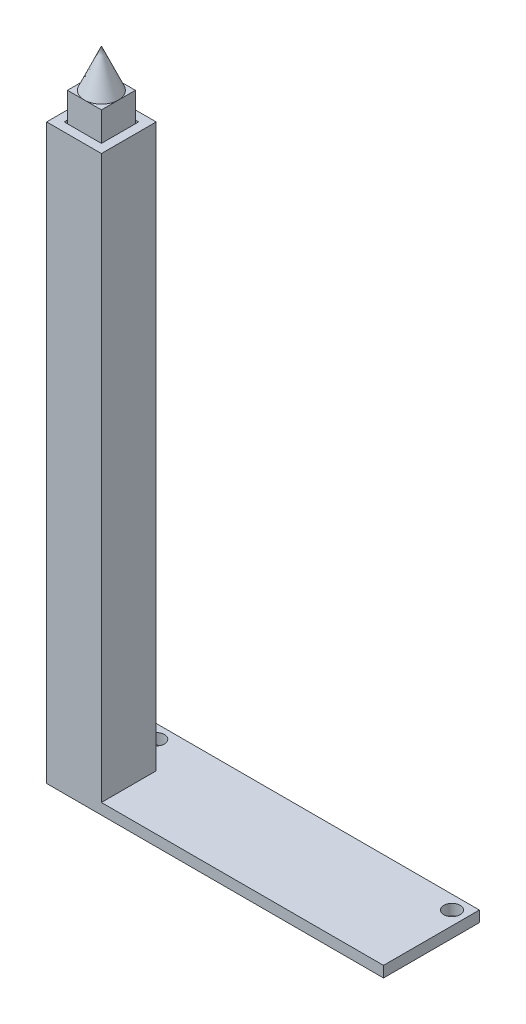
ISO-10303-21;
HEADER;
FILE_DESCRIPTION(('STEP AP214'),'2;1');
FILE_NAME('part.step','',(''),(''),'','','');
FILE_SCHEMA(('AUTOMOTIVE_DESIGN { 1 0 10303 214 1 1 1 1 }'));
ENDSEC;
DATA;
#1=APPLICATION_CONTEXT('core data for automotive mechanical design processes');
#2=APPLICATION_PROTOCOL_DEFINITION('international standard','automotive_design',2000,#1);
#3=PRODUCT_CONTEXT('',#1,'mechanical');
#4=PRODUCT('Part','Part','',(#3));
#5=PRODUCT_RELATED_PRODUCT_CATEGORY('part','',(#4));
#6=PRODUCT_DEFINITION_FORMATION('','',#4);
#7=PRODUCT_DEFINITION_CONTEXT('part definition',#1,'design');
#8=PRODUCT_DEFINITION('design','',#6,#7);
#9=PRODUCT_DEFINITION_SHAPE('','',#8);
#10=(LENGTH_UNIT() NAMED_UNIT(*) SI_UNIT(.MILLI.,.METRE.));
#11=(NAMED_UNIT(*) PLANE_ANGLE_UNIT() SI_UNIT($,.RADIAN.));
#12=(NAMED_UNIT(*) SI_UNIT($,.STERADIAN.) SOLID_ANGLE_UNIT());
#13=UNCERTAINTY_MEASURE_WITH_UNIT(LENGTH_MEASURE(1.E-05),#10,'distance_accuracy_value','');
#14=(GEOMETRIC_REPRESENTATION_CONTEXT(3) GLOBAL_UNCERTAINTY_ASSIGNED_CONTEXT((#13)) GLOBAL_UNIT_ASSIGNED_CONTEXT((#10,
#11,#12)) REPRESENTATION_CONTEXT('',''));
#15=CARTESIAN_POINT('',(0.,0.,0.));
#16=DIRECTION('',(0.,0.,1.));
#17=DIRECTION('',(1.,0.,0.));
#18=AXIS2_PLACEMENT_3D('',#15,#16,#17);
#19=CARTESIAN_POINT('',(0.,109.6,0.));
#20=DIRECTION('',(0.,1.,0.));
#21=DIRECTION('',(0.,0.,1.));
#22=AXIS2_PLACEMENT_3D('',#19,#20,#21);
#23=PLANE('',#22);
#24=DIRECTION('',(1.,0.,0.));
#25=VECTOR('',#24,1.);
#26=CARTESIAN_POINT('',(-28.85,109.6,6.85));
#27=LINE('',#26,#25);
#28=CARTESIAN_POINT('',(-28.85,109.6,6.85));
#29=VERTEX_POINT('',#28);
#30=CARTESIAN_POINT('',(-25.75,109.6,6.85));
#31=VERTEX_POINT('',#30);
#32=EDGE_CURVE('E241',#29,#31,#27,.T.);
#33=ORIENTED_EDGE('',*,*,#32,.T.);
#34=CARTESIAN_POINT('',(-25.75,109.6,3.75));
#35=DIRECTION('',(0.,1.,0.));
#36=DIRECTION('',(0.,0.,1.));
#37=AXIS2_PLACEMENT_3D('',#34,#35,#36);
#38=CIRCLE('',#37,3.10000000000001);
#39=CARTESIAN_POINT('',(-28.85,109.6,3.75));
#40=VERTEX_POINT('',#39);
#41=EDGE_CURVE('E13',#31,#40,#38,.F.);
#42=ORIENTED_EDGE('',*,*,#41,.T.);
#43=DIRECTION('',(0.,0.,1.));
#44=VECTOR('',#43,1.);
#45=CARTESIAN_POINT('',(-28.85,109.6,0.650000000000008));
#46=LINE('',#45,#44);
#47=EDGE_CURVE('E256',#40,#29,#46,.T.);
#48=ORIENTED_EDGE('',*,*,#47,.T.);
#49=EDGE_LOOP('',(#33,#42,#48));
#50=FACE_BOUND('',#49,.T.);
#51=ADVANCED_FACE('F134',(#50),#23,.T.);
#52=CARTESIAN_POINT('',(-28.85,109.6,0.650000000000008));
#53=VERTEX_POINT('',#52);
#54=EDGE_CURVE('E253',#53,#40,#46,.T.);
#55=ORIENTED_EDGE('',*,*,#54,.T.);
#56=CARTESIAN_POINT('',(-25.75,109.6,0.649999999999999));
#57=VERTEX_POINT('',#56);
#58=EDGE_CURVE('E142',#40,#57,#38,.F.);
#59=ORIENTED_EDGE('',*,*,#58,.T.);
#60=DIRECTION('',(-1.,0.,0.));
#61=VECTOR('',#60,1.);
#62=CARTESIAN_POINT('',(-22.65,109.6,0.650000000000006));
#63=LINE('',#62,#61);
#64=EDGE_CURVE('E258',#57,#53,#63,.T.);
#65=ORIENTED_EDGE('',*,*,#64,.T.);
#66=EDGE_LOOP('',(#55,#59,#65));
#67=FACE_BOUND('',#66,.T.);
#68=ADVANCED_FACE('F321',(#67),#23,.T.);
#69=CARTESIAN_POINT('',(-22.65,109.6,0.650000000000006));
#70=VERTEX_POINT('',#69);
#71=EDGE_CURVE('E230',#70,#57,#63,.T.);
#72=ORIENTED_EDGE('',*,*,#71,.T.);
#73=CARTESIAN_POINT('',(-22.65,109.6,3.75));
#74=VERTEX_POINT('',#73);
#75=EDGE_CURVE('E143',#57,#74,#38,.F.);
#76=ORIENTED_EDGE('',*,*,#75,.T.);
#77=DIRECTION('',(0.,0.,-1.));
#78=VECTOR('',#77,1.);
#79=CARTESIAN_POINT('',(-22.65,109.6,6.85));
#80=LINE('',#79,#78);
#81=EDGE_CURVE('E227',#74,#70,#80,.T.);
#82=ORIENTED_EDGE('',*,*,#81,.T.);
#83=EDGE_LOOP('',(#72,#76,#82));
#84=FACE_BOUND('',#83,.T.);
#85=ADVANCED_FACE('F226',(#84),#23,.T.);
#86=CARTESIAN_POINT('',(0.,3.,0.));
#87=DIRECTION('',(0.,-1.,0.));
#88=DIRECTION('',(0.,0.,-1.));
#89=AXIS2_PLACEMENT_3D('',#86,#87,#88);
#90=PLANE('',#89);
#91=DIRECTION('',(0.,0.,-1.));
#92=VECTOR('',#91,1.);
#93=CARTESIAN_POINT('',(-29.45,3.,7.45));
#94=LINE('',#93,#92);
#95=CARTESIAN_POINT('',(-29.45,3.,7.45));
#96=VERTEX_POINT('',#95);
#97=CARTESIAN_POINT('',(-29.45,3.,0.0500000000000083));
#98=VERTEX_POINT('',#97);
#99=EDGE_CURVE('E269',#96,#98,#94,.T.);
#100=ORIENTED_EDGE('',*,*,#99,.F.);
#101=DIRECTION('',(-1.,0.,0.));
#102=VECTOR('',#101,1.);
#103=CARTESIAN_POINT('',(-22.05,3.,7.45));
#104=LINE('',#103,#102);
#105=CARTESIAN_POINT('',(-22.05,3.,7.45));
#106=VERTEX_POINT('',#105);
#107=EDGE_CURVE('E279',#106,#96,#104,.T.);
#108=ORIENTED_EDGE('',*,*,#107,.F.);
#109=DIRECTION('',(0.,0.,1.));
#110=VECTOR('',#109,1.);
#111=CARTESIAN_POINT('',(-22.05,3.,0.0500000000000061));
#112=LINE('',#111,#110);
#113=CARTESIAN_POINT('',(-22.05,3.,0.0500000000000061));
#114=VERTEX_POINT('',#113);
#115=EDGE_CURVE('E276',#114,#106,#112,.T.);
#116=ORIENTED_EDGE('',*,*,#115,.F.);
#117=DIRECTION('',(1.,0.,0.));
#118=VECTOR('',#117,1.);
#119=CARTESIAN_POINT('',(-29.45,3.,0.0500000000000083));
#120=LINE('',#119,#118);
#121=EDGE_CURVE('E272',#98,#114,#120,.T.);
#122=ORIENTED_EDGE('',*,*,#121,.F.);
#123=EDGE_LOOP('',(#100,#108,#116,#122));
#124=FACE_BOUND('',#123,.T.);
#125=DIRECTION('',(0.,0.,1.));
#126=VECTOR('',#125,1.);
#127=CARTESIAN_POINT('',(-28.85,3.,0.650000000000008));
#128=LINE('',#127,#126);
#129=CARTESIAN_POINT('',(-28.85,3.,0.650000000000008));
#130=VERTEX_POINT('',#129);
#131=CARTESIAN_POINT('',(-28.85,3.,6.85));
#132=VERTEX_POINT('',#131);
#133=EDGE_CURVE('E156',#130,#132,#128,.T.);
#134=ORIENTED_EDGE('',*,*,#133,.F.);
#135=DIRECTION('',(-1.,0.,0.));
#136=VECTOR('',#135,1.);
#137=CARTESIAN_POINT('',(-22.65,3.,0.650000000000006));
#138=LINE('',#137,#136);
#139=CARTESIAN_POINT('',(-22.65,3.,0.650000000000006));
#140=VERTEX_POINT('',#139);
#141=EDGE_CURVE('E267',#140,#130,#138,.T.);
#142=ORIENTED_EDGE('',*,*,#141,.F.);
#143=DIRECTION('',(0.,0.,-1.));
#144=VECTOR('',#143,1.);
#145=CARTESIAN_POINT('',(-22.65,3.,6.85));
#146=LINE('',#145,#144);
#147=CARTESIAN_POINT('',(-22.65,3.,6.85));
#148=VERTEX_POINT('',#147);
#149=EDGE_CURVE('E265',#148,#140,#146,.T.);
#150=ORIENTED_EDGE('',*,*,#149,.F.);
#151=DIRECTION('',(1.,0.,0.));
#152=VECTOR('',#151,1.);
#153=CARTESIAN_POINT('',(-28.85,3.,6.85));
#154=LINE('',#153,#152);
#155=EDGE_CURVE('E262',#132,#148,#154,.T.);
#156=ORIENTED_EDGE('',*,*,#155,.F.);
#157=EDGE_LOOP('',(#134,#142,#150,#156));
#158=FACE_BOUND('',#157,.T.);
#159=ADVANCED_FACE('F309',(#124,#158),#90,.F.);
#160=CARTESIAN_POINT('',(-29.45,3.,7.45));
#161=DIRECTION('',(-1.,0.,0.));
#162=DIRECTION('',(0.,0.,1.));
#163=AXIS2_PLACEMENT_3D('',#160,#161,#162);
#164=PLANE('',#163);
#165=DIRECTION('',(0.,0.,-1.));
#166=VECTOR('',#165,1.);
#167=CARTESIAN_POINT('',(-29.45,0.,7.45));
#168=LINE('',#167,#166);
#169=CARTESIAN_POINT('',(-29.45,0.,7.45));
#170=VERTEX_POINT('',#169);
#171=CARTESIAN_POINT('',(-29.45,0.,0.0500000000000083));
#172=VERTEX_POINT('',#171);
#173=EDGE_CURVE('E244',#170,#172,#168,.T.);
#174=ORIENTED_EDGE('',*,*,#173,.F.);
#175=DIRECTION('',(0.,-1.,0.));
#176=VECTOR('',#175,1.);
#177=CARTESIAN_POINT('',(-29.45,3.,7.45));
#178=LINE('',#177,#176);
#179=EDGE_CURVE('E231',#96,#170,#178,.T.);
#180=ORIENTED_EDGE('',*,*,#179,.F.);
#181=ORIENTED_EDGE('',*,*,#99,.T.);
#182=DIRECTION('',(0.,-1.,0.));
#183=VECTOR('',#182,1.);
#184=CARTESIAN_POINT('',(-29.45,3.,0.0500000000000083));
#185=LINE('',#184,#183);
#186=EDGE_CURVE('E281',#98,#172,#185,.T.);
#187=ORIENTED_EDGE('',*,*,#186,.T.);
#188=EDGE_LOOP('',(#174,#180,#181,#187));
#189=FACE_BOUND('',#188,.T.);
#190=ADVANCED_FACE('F136',(#189),#164,.T.);
#191=CARTESIAN_POINT('',(-22.05,3.,7.45));
#192=DIRECTION('',(0.,0.,1.));
#193=DIRECTION('',(1.,0.,0.));
#194=AXIS2_PLACEMENT_3D('',#191,#192,#193);
#195=PLANE('',#194);
#196=DIRECTION('',(-1.,0.,0.));
#197=VECTOR('',#196,1.);
#198=CARTESIAN_POINT('',(-22.05,0.,7.45));
#199=LINE('',#198,#197);
#200=CARTESIAN_POINT('',(-22.05,0.,7.45));
#201=VERTEX_POINT('',#200);
#202=EDGE_CURVE('E273',#201,#170,#199,.T.);
#203=ORIENTED_EDGE('',*,*,#202,.F.);
#204=DIRECTION('',(0.,-1.,0.));
#205=VECTOR('',#204,1.);
#206=CARTESIAN_POINT('',(-22.05,3.,7.45));
#207=LINE('',#206,#205);
#208=EDGE_CURVE('E291',#106,#201,#207,.T.);
#209=ORIENTED_EDGE('',*,*,#208,.F.);
#210=ORIENTED_EDGE('',*,*,#107,.T.);
#211=ORIENTED_EDGE('',*,*,#179,.T.);
#212=EDGE_LOOP('',(#203,#209,#210,#211));
#213=FACE_BOUND('',#212,.T.);
#214=ADVANCED_FACE('F306',(#213),#195,.T.);
#215=CARTESIAN_POINT('',(-22.05,3.,0.0500000000000061));
#216=DIRECTION('',(1.,0.,0.));
#217=DIRECTION('',(0.,0.,-1.));
#218=AXIS2_PLACEMENT_3D('',#215,#216,#217);
#219=PLANE('',#218);
#220=DIRECTION('',(0.,0.,1.));
#221=VECTOR('',#220,1.);
#222=CARTESIAN_POINT('',(-22.05,0.,0.0500000000000061));
#223=LINE('',#222,#221);
#224=CARTESIAN_POINT('',(-22.05,0.,0.0500000000000061));
#225=VERTEX_POINT('',#224);
#226=EDGE_CURVE('E285',#225,#201,#223,.T.);
#227=ORIENTED_EDGE('',*,*,#226,.F.);
#228=DIRECTION('',(0.,-1.,0.));
#229=VECTOR('',#228,1.);
#230=CARTESIAN_POINT('',(-22.05,3.,0.0500000000000061));
#231=LINE('',#230,#229);
#232=EDGE_CURVE('E293',#114,#225,#231,.T.);
#233=ORIENTED_EDGE('',*,*,#232,.F.);
#234=ORIENTED_EDGE('',*,*,#115,.T.);
#235=ORIENTED_EDGE('',*,*,#208,.T.);
#236=EDGE_LOOP('',(#227,#233,#234,#235));
#237=FACE_BOUND('',#236,.T.);
#238=ADVANCED_FACE('F312',(#237),#219,.T.);
#239=CARTESIAN_POINT('',(-29.45,3.,0.0500000000000083));
#240=DIRECTION('',(0.,0.,-1.));
#241=DIRECTION('',(-1.,0.,0.));
#242=AXIS2_PLACEMENT_3D('',#239,#240,#241);
#243=PLANE('',#242);
#244=DIRECTION('',(1.,0.,0.));
#245=VECTOR('',#244,1.);
#246=CARTESIAN_POINT('',(-29.45,0.,0.0500000000000083));
#247=LINE('',#246,#245);
#248=EDGE_CURVE('E246',#172,#225,#247,.T.);
#249=ORIENTED_EDGE('',*,*,#248,.F.);
#250=ORIENTED_EDGE('',*,*,#186,.F.);
#251=ORIENTED_EDGE('',*,*,#121,.T.);
#252=ORIENTED_EDGE('',*,*,#232,.T.);
#253=EDGE_LOOP('',(#249,#250,#251,#252));
#254=FACE_BOUND('',#253,.T.);
#255=ADVANCED_FACE('F300',(#254),#243,.T.);
#256=CARTESIAN_POINT('',(0.,0.,0.));
#257=DIRECTION('',(0.,-1.,0.));
#258=DIRECTION('',(0.,0.,-1.));
#259=AXIS2_PLACEMENT_3D('',#256,#257,#258);
#260=PLANE('',#259);
#261=ORIENTED_EDGE('',*,*,#173,.T.);
#262=ORIENTED_EDGE('',*,*,#248,.T.);
#263=ORIENTED_EDGE('',*,*,#226,.T.);
#264=ORIENTED_EDGE('',*,*,#202,.T.);
#265=EDGE_LOOP('',(#261,#262,#263,#264));
#266=FACE_BOUND('',#265,.T.);
#267=ADVANCED_FACE('F303',(#266),#260,.T.);
#268=CARTESIAN_POINT('',(-28.85,123.368124086713,0.650000000000008));
#269=DIRECTION('',(1.,0.,0.));
#270=DIRECTION('',(0.,0.,-1.));
#271=AXIS2_PLACEMENT_3D('',#268,#269,#270);
#272=PLANE('',#271);
#273=ORIENTED_EDGE('',*,*,#54,.F.);
#274=DIRECTION('',(0.,-1.,0.));
#275=VECTOR('',#274,1.);
#276=CARTESIAN_POINT('',(-28.85,123.368124086713,0.650000000000008));
#277=LINE('',#276,#275);
#278=EDGE_CURVE('E221',#53,#130,#277,.T.);
#279=ORIENTED_EDGE('',*,*,#278,.T.);
#280=ORIENTED_EDGE('',*,*,#133,.T.);
#281=DIRECTION('',(0.,-1.,0.));
#282=VECTOR('',#281,1.);
#283=CARTESIAN_POINT('',(-28.85,123.368124086713,6.85));
#284=LINE('',#283,#282);
#285=EDGE_CURVE('E259',#29,#132,#284,.T.);
#286=ORIENTED_EDGE('',*,*,#285,.F.);
#287=ORIENTED_EDGE('',*,*,#47,.F.);
#288=EDGE_LOOP('',(#273,#279,#280,#286,#287));
#289=FACE_BOUND('',#288,.T.);
#290=ADVANCED_FACE('F347',(#289),#272,.F.);
#291=CARTESIAN_POINT('',(-28.85,123.368124086713,6.85));
#292=DIRECTION('',(0.,0.,-1.));
#293=DIRECTION('',(-1.,0.,0.));
#294=AXIS2_PLACEMENT_3D('',#291,#292,#293);
#295=PLANE('',#294);
#296=ORIENTED_EDGE('',*,*,#32,.F.);
#297=ORIENTED_EDGE('',*,*,#285,.T.);
#298=ORIENTED_EDGE('',*,*,#155,.T.);
#299=DIRECTION('',(0.,-1.,0.));
#300=VECTOR('',#299,1.);
#301=CARTESIAN_POINT('',(-22.65,123.368124086713,6.85));
#302=LINE('',#301,#300);
#303=CARTESIAN_POINT('',(-22.65,109.6,6.85));
#304=VERTEX_POINT('',#303);
#305=EDGE_CURVE('E263',#304,#148,#302,.T.);
#306=ORIENTED_EDGE('',*,*,#305,.F.);
#307=EDGE_CURVE('E243',#31,#304,#27,.T.);
#308=ORIENTED_EDGE('',*,*,#307,.F.);
#309=EDGE_LOOP('',(#296,#297,#298,#306,#308));
#310=FACE_BOUND('',#309,.T.);
#311=ADVANCED_FACE('F350',(#310),#295,.F.);
#312=CARTESIAN_POINT('',(-22.65,123.368124086713,6.85));
#313=DIRECTION('',(-1.,0.,0.));
#314=DIRECTION('',(0.,0.,1.));
#315=AXIS2_PLACEMENT_3D('',#312,#313,#314);
#316=PLANE('',#315);
#317=EDGE_CURVE('E236',#304,#74,#80,.T.);
#318=ORIENTED_EDGE('',*,*,#317,.F.);
#319=ORIENTED_EDGE('',*,*,#305,.T.);
#320=ORIENTED_EDGE('',*,*,#149,.T.);
#321=DIRECTION('',(0.,-1.,0.));
#322=VECTOR('',#321,1.);
#323=CARTESIAN_POINT('',(-22.65,123.368124086713,0.650000000000006));
#324=LINE('',#323,#322);
#325=EDGE_CURVE('E240',#70,#140,#324,.T.);
#326=ORIENTED_EDGE('',*,*,#325,.F.);
#327=ORIENTED_EDGE('',*,*,#81,.F.);
#328=EDGE_LOOP('',(#318,#319,#320,#326,#327));
#329=FACE_BOUND('',#328,.T.);
#330=ADVANCED_FACE('F234',(#329),#316,.F.);
#331=CARTESIAN_POINT('',(-22.65,123.368124086713,0.650000000000006));
#332=DIRECTION('',(0.,0.,1.));
#333=DIRECTION('',(1.,0.,0.));
#334=AXIS2_PLACEMENT_3D('',#331,#332,#333);
#335=PLANE('',#334);
#336=ORIENTED_EDGE('',*,*,#71,.F.);
#337=ORIENTED_EDGE('',*,*,#325,.T.);
#338=ORIENTED_EDGE('',*,*,#141,.T.);
#339=ORIENTED_EDGE('',*,*,#278,.F.);
#340=ORIENTED_EDGE('',*,*,#64,.F.);
#341=EDGE_LOOP('',(#336,#337,#338,#339,#340));
#342=FACE_BOUND('',#341,.T.);
#343=ADVANCED_FACE('F332',(#342),#335,.F.);
#344=ORIENTED_EDGE('',*,*,#317,.T.);
#345=CARTESIAN_POINT('',(-25.75,109.6,3.75));
#346=DIRECTION('',(0.,1.,0.));
#347=DIRECTION('',(0.,0.,1.));
#348=AXIS2_PLACEMENT_3D('',#345,#346,#347);
#349=CIRCLE('',#348,3.10000000000001);
#350=EDGE_CURVE('E215',#31,#74,#349,.T.);
#351=ORIENTED_EDGE('',*,*,#350,.F.);
#352=ORIENTED_EDGE('',*,*,#307,.T.);
#353=EDGE_LOOP('',(#344,#351,#352));
#354=FACE_BOUND('',#353,.T.);
#355=ADVANCED_FACE('F213',(#354),#23,.T.);
#356=CARTESIAN_POINT('',(-25.75,109.6,3.75));
#357=DIRECTION('',(0.,-1.,0.));
#358=DIRECTION('',(0.,0.,-1.));
#359=AXIS2_PLACEMENT_3D('',#356,#357,#358);
#360=CONICAL_SURFACE('',#359,3.10000000000001,0.416898070409894);
#361=CARTESIAN_POINT('',(-25.75,116.6,3.75));
#362=VERTEX_POINT('',#361);
#363=VERTEX_LOOP('',#362);
#364=FACE_BOUND('',#363,.T.);
#365=ORIENTED_EDGE('',*,*,#350,.T.);
#366=ORIENTED_EDGE('',*,*,#75,.F.);
#367=ORIENTED_EDGE('',*,*,#58,.F.);
#368=ORIENTED_EDGE('',*,*,#41,.F.);
#369=EDGE_LOOP('',(#365,#366,#367,#368));
#370=FACE_BOUND('',#369,.T.);
#371=ADVANCED_FACE('F211',(#364,#370),#360,.T.);
#372=CLOSED_SHELL('',(#51,#68,#85,#159,#190,#214,#238,#255,#267,#290,#311,#330,#343,#355,#371));
#373=MANIFOLD_SOLID_BREP('B2',#372);
#374=CARTESIAN_POINT('',(0.,2.,0.));
#375=DIRECTION('',(0.,1.,0.));
#376=DIRECTION('',(0.,0.,1.));
#377=AXIS2_PLACEMENT_3D('',#374,#375,#376);
#378=PLANE('',#377);
#379=CARTESIAN_POINT('',(-25.75,2.,-6.25));
#380=DIRECTION('',(0.,1.,0.));
#381=DIRECTION('',(0.,0.,1.));
#382=AXIS2_PLACEMENT_3D('',#379,#380,#381);
#383=CIRCLE('',#382,1.5);
#384=CARTESIAN_POINT('',(-25.75,2.,-4.75));
#385=VERTEX_POINT('',#384);
#386=EDGE_CURVE('E594',#385,#385,#383,.T.);
#387=ORIENTED_EDGE('',*,*,#386,.F.);
#388=EDGE_LOOP('',(#387));
#389=FACE_BOUND('',#388,.T.);
#390=CARTESIAN_POINT('',(28.25,2.,-6.25));
#391=DIRECTION('',(0.,1.,0.));
#392=DIRECTION('',(0.,0.,1.));
#393=AXIS2_PLACEMENT_3D('',#390,#391,#392);
#394=CIRCLE('',#393,1.5);
#395=CARTESIAN_POINT('',(28.25,2.,-4.75));
#396=VERTEX_POINT('',#395);
#397=EDGE_CURVE('E597',#396,#396,#394,.T.);
#398=ORIENTED_EDGE('',*,*,#397,.F.);
#399=EDGE_LOOP('',(#398));
#400=FACE_BOUND('',#399,.T.);
#401=DIRECTION('',(1.,0.,0.));
#402=VECTOR('',#401,1.);
#403=CARTESIAN_POINT('',(0.,2.,-1.25));
#404=LINE('',#403,#402);
#405=CARTESIAN_POINT('',(-30.75,2.,-1.25));
#406=VERTEX_POINT('',#405);
#407=CARTESIAN_POINT('',(-20.75,2.,-1.25));
#408=VERTEX_POINT('',#407);
#409=EDGE_CURVE('E458',#406,#408,#404,.T.);
#410=ORIENTED_EDGE('',*,*,#409,.T.);
#411=DIRECTION('',(0.,0.,1.));
#412=VECTOR('',#411,1.);
#413=CARTESIAN_POINT('',(-20.75,2.,0.));
#414=LINE('',#413,#412);
#415=CARTESIAN_POINT('',(-20.75,2.,8.75));
#416=VERTEX_POINT('',#415);
#417=EDGE_CURVE('E132',#408,#416,#414,.T.);
#418=ORIENTED_EDGE('',*,*,#417,.T.);
#419=DIRECTION('',(-1.,0.,0.));
#420=VECTOR('',#419,1.);
#421=CARTESIAN_POINT('',(0.,2.,8.75));
#422=LINE('',#421,#420);
#423=CARTESIAN_POINT('',(30.75,2.,8.75));
#424=VERTEX_POINT('',#423);
#425=EDGE_CURVE('E587',#424,#416,#422,.T.);
#426=ORIENTED_EDGE('',*,*,#425,.F.);
#427=DIRECTION('',(0.,0.,-1.));
#428=VECTOR('',#427,1.);
#429=CARTESIAN_POINT('',(30.75,2.,0.));
#430=LINE('',#429,#428);
#431=CARTESIAN_POINT('',(30.75,2.,-8.75));
#432=VERTEX_POINT('',#431);
#433=EDGE_CURVE('E590',#424,#432,#430,.T.);
#434=ORIENTED_EDGE('',*,*,#433,.T.);
#435=DIRECTION('',(-1.,0.,0.));
#436=VECTOR('',#435,1.);
#437=CARTESIAN_POINT('',(0.,2.,-8.75));
#438=LINE('',#437,#436);
#439=CARTESIAN_POINT('',(-30.75,2.,-8.75));
#440=VERTEX_POINT('',#439);
#441=EDGE_CURVE('E592',#432,#440,#438,.T.);
#442=ORIENTED_EDGE('',*,*,#441,.T.);
#443=DIRECTION('',(0.,0.,-1.));
#444=VECTOR('',#443,1.);
#445=CARTESIAN_POINT('',(-30.75,2.,0.));
#446=LINE('',#445,#444);
#447=EDGE_CURVE('E466',#406,#440,#446,.T.);
#448=ORIENTED_EDGE('',*,*,#447,.F.);
#449=EDGE_LOOP('',(#410,#418,#426,#434,#442,#448));
#450=FACE_BOUND('',#449,.T.);
#451=ADVANCED_FACE('F449',(#389,#400,#450),#378,.T.);
#452=CARTESIAN_POINT('',(0.,2.,8.75));
#453=DIRECTION('',(0.,0.,1.));
#454=DIRECTION('',(1.,0.,0.));
#455=AXIS2_PLACEMENT_3D('',#452,#453,#454);
#456=PLANE('',#455);
#457=DIRECTION('',(0.,-1.,0.));
#458=VECTOR('',#457,1.);
#459=CARTESIAN_POINT('',(-30.75,2.,8.75));
#460=LINE('',#459,#458);
#461=CARTESIAN_POINT('',(-30.75,104.6,8.75));
#462=VERTEX_POINT('',#461);
#463=CARTESIAN_POINT('',(-30.75,0.,8.75));
#464=VERTEX_POINT('',#463);
#465=EDGE_CURVE('E539',#462,#464,#460,.T.);
#466=ORIENTED_EDGE('',*,*,#465,.T.);
#467=DIRECTION('',(-1.,0.,0.));
#468=VECTOR('',#467,1.);
#469=CARTESIAN_POINT('',(0.,0.,8.75));
#470=LINE('',#469,#468);
#471=CARTESIAN_POINT('',(30.75,0.,8.75));
#472=VERTEX_POINT('',#471);
#473=EDGE_CURVE('E496',#472,#464,#470,.T.);
#474=ORIENTED_EDGE('',*,*,#473,.F.);
#475=DIRECTION('',(0.,-1.,0.));
#476=VECTOR('',#475,1.);
#477=CARTESIAN_POINT('',(30.75,2.,8.75));
#478=LINE('',#477,#476);
#479=EDGE_CURVE('E543',#424,#472,#478,.T.);
#480=ORIENTED_EDGE('',*,*,#479,.F.);
#481=ORIENTED_EDGE('',*,*,#425,.T.);
#482=DIRECTION('',(0.,-1.,0.));
#483=VECTOR('',#482,1.);
#484=CARTESIAN_POINT('',(-20.75,101.6,8.75));
#485=LINE('',#484,#483);
#486=CARTESIAN_POINT('',(-20.75,104.6,8.75));
#487=VERTEX_POINT('',#486);
#488=EDGE_CURVE('E739',#487,#416,#485,.T.);
#489=ORIENTED_EDGE('',*,*,#488,.F.);
#490=DIRECTION('',(1.,0.,0.));
#491=VECTOR('',#490,1.);
#492=CARTESIAN_POINT('',(0.,104.6,8.75));
#493=LINE('',#492,#491);
#494=EDGE_CURVE('E680',#462,#487,#493,.T.);
#495=ORIENTED_EDGE('',*,*,#494,.F.);
#496=EDGE_LOOP('',(#466,#474,#480,#481,#489,#495));
#497=FACE_BOUND('',#496,.T.);
#498=ADVANCED_FACE('F584',(#497),#456,.T.);
#499=CARTESIAN_POINT('',(30.75,2.,0.));
#500=DIRECTION('',(-1.,0.,0.));
#501=DIRECTION('',(0.,0.,1.));
#502=AXIS2_PLACEMENT_3D('',#499,#500,#501);
#503=PLANE('',#502);
#504=DIRECTION('',(0.,0.,-1.));
#505=VECTOR('',#504,1.);
#506=CARTESIAN_POINT('',(30.75,0.,0.));
#507=LINE('',#506,#505);
#508=CARTESIAN_POINT('',(30.75,0.,-8.75));
#509=VERTEX_POINT('',#508);
#510=EDGE_CURVE('E609',#472,#509,#507,.T.);
#511=ORIENTED_EDGE('',*,*,#510,.T.);
#512=DIRECTION('',(0.,-1.,0.));
#513=VECTOR('',#512,1.);
#514=CARTESIAN_POINT('',(30.75,2.,-8.75));
#515=LINE('',#514,#513);
#516=EDGE_CURVE('E546',#432,#509,#515,.T.);
#517=ORIENTED_EDGE('',*,*,#516,.F.);
#518=ORIENTED_EDGE('',*,*,#433,.F.);
#519=ORIENTED_EDGE('',*,*,#479,.T.);
#520=EDGE_LOOP('',(#511,#517,#518,#519));
#521=FACE_BOUND('',#520,.T.);
#522=ADVANCED_FACE('F591',(#521),#503,.F.);
#523=CARTESIAN_POINT('',(0.,2.,-8.75));
#524=DIRECTION('',(0.,0.,1.));
#525=DIRECTION('',(1.,0.,0.));
#526=AXIS2_PLACEMENT_3D('',#523,#524,#525);
#527=PLANE('',#526);
#528=DIRECTION('',(-1.,0.,0.));
#529=VECTOR('',#528,1.);
#530=CARTESIAN_POINT('',(0.,0.,-8.75));
#531=LINE('',#530,#529);
#532=CARTESIAN_POINT('',(-30.75,0.,-8.75));
#533=VERTEX_POINT('',#532);
#534=EDGE_CURVE('E611',#509,#533,#531,.T.);
#535=ORIENTED_EDGE('',*,*,#534,.T.);
#536=DIRECTION('',(0.,-1.,0.));
#537=VECTOR('',#536,1.);
#538=CARTESIAN_POINT('',(-30.75,2.,-8.75));
#539=LINE('',#538,#537);
#540=EDGE_CURVE('E553',#440,#533,#539,.T.);
#541=ORIENTED_EDGE('',*,*,#540,.F.);
#542=ORIENTED_EDGE('',*,*,#441,.F.);
#543=ORIENTED_EDGE('',*,*,#516,.T.);
#544=EDGE_LOOP('',(#535,#541,#542,#543));
#545=FACE_BOUND('',#544,.T.);
#546=ADVANCED_FACE('F619',(#545),#527,.F.);
#547=CARTESIAN_POINT('',(-30.75,2.,0.));
#548=DIRECTION('',(-1.,0.,0.));
#549=DIRECTION('',(0.,0.,1.));
#550=AXIS2_PLACEMENT_3D('',#547,#548,#549);
#551=PLANE('',#550);
#552=DIRECTION('',(0.,-1.,0.));
#553=VECTOR('',#552,1.);
#554=CARTESIAN_POINT('',(-30.75,101.6,-1.25));
#555=LINE('',#554,#553);
#556=CARTESIAN_POINT('',(-30.75,104.6,-1.25));
#557=VERTEX_POINT('',#556);
#558=EDGE_CURVE('E741',#557,#406,#555,.T.);
#559=ORIENTED_EDGE('',*,*,#558,.T.);
#560=ORIENTED_EDGE('',*,*,#447,.T.);
#561=ORIENTED_EDGE('',*,*,#540,.T.);
#562=DIRECTION('',(0.,0.,-1.));
#563=VECTOR('',#562,1.);
#564=CARTESIAN_POINT('',(-30.75,0.,0.));
#565=LINE('',#564,#563);
#566=EDGE_CURVE('E614',#464,#533,#565,.T.);
#567=ORIENTED_EDGE('',*,*,#566,.F.);
#568=ORIENTED_EDGE('',*,*,#465,.F.);
#569=DIRECTION('',(0.,0.,1.));
#570=VECTOR('',#569,1.);
#571=CARTESIAN_POINT('',(-30.75,104.6,0.));
#572=LINE('',#571,#570);
#573=EDGE_CURVE('E699',#557,#462,#572,.T.);
#574=ORIENTED_EDGE('',*,*,#573,.F.);
#575=EDGE_LOOP('',(#559,#560,#561,#567,#568,#574));
#576=FACE_BOUND('',#575,.T.);
#577=ADVANCED_FACE('F616',(#576),#551,.T.);
#578=CARTESIAN_POINT('',(-25.75,2.,-6.25));
#579=DIRECTION('',(0.,-1.,0.));
#580=DIRECTION('',(0.,0.,-1.));
#581=AXIS2_PLACEMENT_3D('',#578,#579,#580);
#582=CYLINDRICAL_SURFACE('',#581,1.5);
#583=ORIENTED_EDGE('',*,*,#386,.T.);
#584=EDGE_LOOP('',(#583));
#585=FACE_BOUND('',#584,.T.);
#586=CARTESIAN_POINT('',(-25.75,0.,-6.25));
#587=DIRECTION('',(0.,1.,0.));
#588=DIRECTION('',(0.,0.,1.));
#589=AXIS2_PLACEMENT_3D('',#586,#587,#588);
#590=CIRCLE('',#589,1.5);
#591=CARTESIAN_POINT('',(-25.75,0.,-4.75));
#592=VERTEX_POINT('',#591);
#593=EDGE_CURVE('E605',#592,#592,#590,.T.);
#594=ORIENTED_EDGE('',*,*,#593,.F.);
#595=EDGE_LOOP('',(#594));
#596=FACE_BOUND('',#595,.T.);
#597=ADVANCED_FACE('F630',(#585,#596),#582,.F.);
#598=CARTESIAN_POINT('',(28.25,2.,-6.25));
#599=DIRECTION('',(0.,-1.,0.));
#600=DIRECTION('',(0.,0.,-1.));
#601=AXIS2_PLACEMENT_3D('',#598,#599,#600);
#602=CYLINDRICAL_SURFACE('',#601,1.5);
#603=ORIENTED_EDGE('',*,*,#397,.T.);
#604=EDGE_LOOP('',(#603));
#605=FACE_BOUND('',#604,.T.);
#606=CARTESIAN_POINT('',(28.25,0.,-6.25));
#607=DIRECTION('',(0.,1.,0.));
#608=DIRECTION('',(0.,0.,1.));
#609=AXIS2_PLACEMENT_3D('',#606,#607,#608);
#610=CIRCLE('',#609,1.5);
#611=CARTESIAN_POINT('',(28.25,0.,-4.75));
#612=VERTEX_POINT('',#611);
#613=EDGE_CURVE('E541',#612,#612,#610,.T.);
#614=ORIENTED_EDGE('',*,*,#613,.F.);
#615=EDGE_LOOP('',(#614));
#616=FACE_BOUND('',#615,.T.);
#617=ADVANCED_FACE('F621',(#605,#616),#602,.F.);
#618=CARTESIAN_POINT('',(0.,0.,0.));
#619=DIRECTION('',(0.,1.,0.));
#620=DIRECTION('',(0.,0.,1.));
#621=AXIS2_PLACEMENT_3D('',#618,#619,#620);
#622=PLANE('',#621);
#623=ORIENTED_EDGE('',*,*,#473,.T.);
#624=ORIENTED_EDGE('',*,*,#566,.T.);
#625=ORIENTED_EDGE('',*,*,#534,.F.);
#626=ORIENTED_EDGE('',*,*,#510,.F.);
#627=EDGE_LOOP('',(#623,#624,#625,#626));
#628=FACE_BOUND('',#627,.T.);
#629=DIRECTION('',(-1.,0.,0.));
#630=VECTOR('',#629,1.);
#631=CARTESIAN_POINT('',(0.,0.,7.75));
#632=LINE('',#631,#630);
#633=CARTESIAN_POINT('',(-21.75,0.,7.75));
#634=VERTEX_POINT('',#633);
#635=CARTESIAN_POINT('',(-29.75,0.,7.75));
#636=VERTEX_POINT('',#635);
#637=EDGE_CURVE('E502',#634,#636,#632,.T.);
#638=ORIENTED_EDGE('',*,*,#637,.F.);
#639=DIRECTION('',(0.,0.,-1.));
#640=VECTOR('',#639,1.);
#641=CARTESIAN_POINT('',(-21.75,0.,0.));
#642=LINE('',#641,#640);
#643=CARTESIAN_POINT('',(-21.75,0.,-0.249999999999994));
#644=VERTEX_POINT('',#643);
#645=EDGE_CURVE('E514',#634,#644,#642,.T.);
#646=ORIENTED_EDGE('',*,*,#645,.T.);
#647=DIRECTION('',(-1.,0.,0.));
#648=VECTOR('',#647,1.);
#649=CARTESIAN_POINT('',(0.,0.,-0.250000000000001));
#650=LINE('',#649,#648);
#651=CARTESIAN_POINT('',(-29.75,0.,-0.249999999999992));
#652=VERTEX_POINT('',#651);
#653=EDGE_CURVE('E530',#644,#652,#650,.T.);
#654=ORIENTED_EDGE('',*,*,#653,.T.);
#655=DIRECTION('',(0.,0.,-1.));
#656=VECTOR('',#655,1.);
#657=CARTESIAN_POINT('',(-29.75,0.,0.));
#658=LINE('',#657,#656);
#659=EDGE_CURVE('E521',#636,#652,#658,.T.);
#660=ORIENTED_EDGE('',*,*,#659,.F.);
#661=EDGE_LOOP('',(#638,#646,#654,#660));
#662=FACE_BOUND('',#661,.T.);
#663=ORIENTED_EDGE('',*,*,#593,.T.);
#664=EDGE_LOOP('',(#663));
#665=FACE_BOUND('',#664,.T.);
#666=ORIENTED_EDGE('',*,*,#613,.T.);
#667=EDGE_LOOP('',(#666));
#668=FACE_BOUND('',#667,.T.);
#669=ADVANCED_FACE('F527',(#628,#662,#665,#668),#622,.F.);
#670=CARTESIAN_POINT('',(-29.75,2.,0.));
#671=DIRECTION('',(-1.,0.,0.));
#672=DIRECTION('',(0.,0.,1.));
#673=AXIS2_PLACEMENT_3D('',#670,#671,#672);
#674=PLANE('',#673);
#675=ORIENTED_EDGE('',*,*,#659,.T.);
#676=DIRECTION('',(0.,-1.,0.));
#677=VECTOR('',#676,1.);
#678=CARTESIAN_POINT('',(-29.75,2.,-0.249999999999992));
#679=LINE('',#678,#677);
#680=CARTESIAN_POINT('',(-29.75,101.6,-0.249999999999992));
#681=VERTEX_POINT('',#680);
#682=EDGE_CURVE('E525',#681,#652,#679,.T.);
#683=ORIENTED_EDGE('',*,*,#682,.F.);
#684=DIRECTION('',(0.,0.,-1.));
#685=VECTOR('',#684,1.);
#686=CARTESIAN_POINT('',(-29.75,101.6,0.));
#687=LINE('',#686,#685);
#688=CARTESIAN_POINT('',(-29.75,101.6,7.75));
#689=VERTEX_POINT('',#688);
#690=EDGE_CURVE('E524',#689,#681,#687,.T.);
#691=ORIENTED_EDGE('',*,*,#690,.F.);
#692=DIRECTION('',(0.,-1.,0.));
#693=VECTOR('',#692,1.);
#694=CARTESIAN_POINT('',(-29.75,2.,7.75));
#695=LINE('',#694,#693);
#696=EDGE_CURVE('E506',#689,#636,#695,.T.);
#697=ORIENTED_EDGE('',*,*,#696,.T.);
#698=EDGE_LOOP('',(#675,#683,#691,#697));
#699=FACE_BOUND('',#698,.T.);
#700=ADVANCED_FACE('F519',(#699),#674,.F.);
#701=CARTESIAN_POINT('',(0.,2.,-0.250000000000001));
#702=DIRECTION('',(0.,0.,1.));
#703=DIRECTION('',(1.,0.,0.));
#704=AXIS2_PLACEMENT_3D('',#701,#702,#703);
#705=PLANE('',#704);
#706=ORIENTED_EDGE('',*,*,#653,.F.);
#707=DIRECTION('',(0.,-1.,0.));
#708=VECTOR('',#707,1.);
#709=CARTESIAN_POINT('',(-21.75,2.,-0.249999999999994));
#710=LINE('',#709,#708);
#711=CARTESIAN_POINT('',(-21.75,101.6,-0.249999999999994));
#712=VERTEX_POINT('',#711);
#713=EDGE_CURVE('E536',#712,#644,#710,.T.);
#714=ORIENTED_EDGE('',*,*,#713,.F.);
#715=DIRECTION('',(-1.,0.,0.));
#716=VECTOR('',#715,1.);
#717=CARTESIAN_POINT('',(0.,101.6,-0.250000000000001));
#718=LINE('',#717,#716);
#719=EDGE_CURVE('E569',#712,#681,#718,.T.);
#720=ORIENTED_EDGE('',*,*,#719,.T.);
#721=ORIENTED_EDGE('',*,*,#682,.T.);
#722=EDGE_LOOP('',(#706,#714,#720,#721));
#723=FACE_BOUND('',#722,.T.);
#724=ADVANCED_FACE('F566',(#723),#705,.T.);
#725=CARTESIAN_POINT('',(-21.75,2.,0.));
#726=DIRECTION('',(-1.,0.,0.));
#727=DIRECTION('',(0.,0.,1.));
#728=AXIS2_PLACEMENT_3D('',#725,#726,#727);
#729=PLANE('',#728);
#730=ORIENTED_EDGE('',*,*,#645,.F.);
#731=DIRECTION('',(0.,-1.,0.));
#732=VECTOR('',#731,1.);
#733=CARTESIAN_POINT('',(-21.75,2.,7.75));
#734=LINE('',#733,#732);
#735=CARTESIAN_POINT('',(-21.75,101.6,7.75));
#736=VERTEX_POINT('',#735);
#737=EDGE_CURVE('E509',#736,#634,#734,.T.);
#738=ORIENTED_EDGE('',*,*,#737,.F.);
#739=DIRECTION('',(0.,0.,-1.));
#740=VECTOR('',#739,1.);
#741=CARTESIAN_POINT('',(-21.75,101.6,0.));
#742=LINE('',#741,#740);
#743=EDGE_CURVE('E563',#736,#712,#742,.T.);
#744=ORIENTED_EDGE('',*,*,#743,.T.);
#745=ORIENTED_EDGE('',*,*,#713,.T.);
#746=EDGE_LOOP('',(#730,#738,#744,#745));
#747=FACE_BOUND('',#746,.T.);
#748=ADVANCED_FACE('F557',(#747),#729,.T.);
#749=CARTESIAN_POINT('',(0.,2.,7.75));
#750=DIRECTION('',(0.,0.,1.));
#751=DIRECTION('',(1.,0.,0.));
#752=AXIS2_PLACEMENT_3D('',#749,#750,#751);
#753=PLANE('',#752);
#754=ORIENTED_EDGE('',*,*,#637,.T.);
#755=ORIENTED_EDGE('',*,*,#696,.F.);
#756=DIRECTION('',(-1.,0.,0.));
#757=VECTOR('',#756,1.);
#758=CARTESIAN_POINT('',(0.,101.6,7.75));
#759=LINE('',#758,#757);
#760=EDGE_CURVE('E735',#736,#689,#759,.T.);
#761=ORIENTED_EDGE('',*,*,#760,.F.);
#762=ORIENTED_EDGE('',*,*,#737,.T.);
#763=EDGE_LOOP('',(#754,#755,#761,#762));
#764=FACE_BOUND('',#763,.T.);
#765=ADVANCED_FACE('F451',(#764),#753,.F.);
#766=CARTESIAN_POINT('',(-20.75,101.6,0.));
#767=DIRECTION('',(-1.,0.,0.));
#768=DIRECTION('',(0.,0.,1.));
#769=AXIS2_PLACEMENT_3D('',#766,#767,#768);
#770=PLANE('',#769);
#771=ORIENTED_EDGE('',*,*,#417,.F.);
#772=DIRECTION('',(0.,-1.,0.));
#773=VECTOR('',#772,1.);
#774=CARTESIAN_POINT('',(-20.75,101.6,-1.25));
#775=LINE('',#774,#773);
#776=CARTESIAN_POINT('',(-20.75,104.6,-1.25));
#777=VERTEX_POINT('',#776);
#778=EDGE_CURVE('E515',#777,#408,#775,.T.);
#779=ORIENTED_EDGE('',*,*,#778,.F.);
#780=DIRECTION('',(0.,0.,-1.));
#781=VECTOR('',#780,1.);
#782=CARTESIAN_POINT('',(-20.75,104.6,0.));
#783=LINE('',#782,#781);
#784=EDGE_CURVE('E756',#487,#777,#783,.T.);
#785=ORIENTED_EDGE('',*,*,#784,.F.);
#786=ORIENTED_EDGE('',*,*,#488,.T.);
#787=EDGE_LOOP('',(#771,#779,#785,#786));
#788=FACE_BOUND('',#787,.T.);
#789=ADVANCED_FACE('F642',(#788),#770,.F.);
#790=CARTESIAN_POINT('',(0.,101.6,-1.25));
#791=DIRECTION('',(0.,0.,1.));
#792=DIRECTION('',(1.,0.,0.));
#793=AXIS2_PLACEMENT_3D('',#790,#791,#792);
#794=PLANE('',#793);
#795=ORIENTED_EDGE('',*,*,#409,.F.);
#796=ORIENTED_EDGE('',*,*,#558,.F.);
#797=DIRECTION('',(-1.,0.,0.));
#798=VECTOR('',#797,1.);
#799=CARTESIAN_POINT('',(0.,104.6,-1.25));
#800=LINE('',#799,#798);
#801=EDGE_CURVE('E754',#777,#557,#800,.T.);
#802=ORIENTED_EDGE('',*,*,#801,.F.);
#803=ORIENTED_EDGE('',*,*,#778,.T.);
#804=EDGE_LOOP('',(#795,#796,#802,#803));
#805=FACE_BOUND('',#804,.T.);
#806=ADVANCED_FACE('F645',(#805),#794,.F.);
#807=CARTESIAN_POINT('',(-29.15,104.6,0.));
#808=DIRECTION('',(1.,0.,0.));
#809=DIRECTION('',(0.,0.,-1.));
#810=AXIS2_PLACEMENT_3D('',#807,#808,#809);
#811=PLANE('',#810);
#812=DIRECTION('',(0.,0.,1.));
#813=VECTOR('',#812,1.);
#814=CARTESIAN_POINT('',(-29.15,101.6,0.));
#815=LINE('',#814,#813);
#816=CARTESIAN_POINT('',(-29.15,101.6,0.350000000000008));
#817=VERTEX_POINT('',#816);
#818=CARTESIAN_POINT('',(-29.15,101.6,7.15));
#819=VERTEX_POINT('',#818);
#820=EDGE_CURVE('E716',#817,#819,#815,.T.);
#821=ORIENTED_EDGE('',*,*,#820,.F.);
#822=DIRECTION('',(0.,-1.,0.));
#823=VECTOR('',#822,1.);
#824=CARTESIAN_POINT('',(-29.15,104.6,0.350000000000008));
#825=LINE('',#824,#823);
#826=CARTESIAN_POINT('',(-29.15,104.6,0.350000000000008));
#827=VERTEX_POINT('',#826);
#828=EDGE_CURVE('E705',#827,#817,#825,.T.);
#829=ORIENTED_EDGE('',*,*,#828,.F.);
#830=DIRECTION('',(0.,0.,1.));
#831=VECTOR('',#830,1.);
#832=CARTESIAN_POINT('',(-29.15,104.6,0.));
#833=LINE('',#832,#831);
#834=CARTESIAN_POINT('',(-29.15,104.6,7.15));
#835=VERTEX_POINT('',#834);
#836=EDGE_CURVE('E686',#827,#835,#833,.T.);
#837=ORIENTED_EDGE('',*,*,#836,.T.);
#838=DIRECTION('',(0.,-1.,0.));
#839=VECTOR('',#838,1.);
#840=CARTESIAN_POINT('',(-29.15,104.6,7.15));
#841=LINE('',#840,#839);
#842=EDGE_CURVE('E715',#835,#819,#841,.T.);
#843=ORIENTED_EDGE('',*,*,#842,.T.);
#844=EDGE_LOOP('',(#821,#829,#837,#843));
#845=FACE_BOUND('',#844,.T.);
#846=ADVANCED_FACE('F649',(#845),#811,.T.);
#847=CARTESIAN_POINT('',(0.,104.6,0.349999999999999));
#848=DIRECTION('',(0.,0.,1.));
#849=DIRECTION('',(1.,0.,0.));
#850=AXIS2_PLACEMENT_3D('',#847,#848,#849);
#851=PLANE('',#850);
#852=DIRECTION('',(-1.,0.,0.));
#853=VECTOR('',#852,1.);
#854=CARTESIAN_POINT('',(0.,101.6,0.349999999999999));
#855=LINE('',#854,#853);
#856=CARTESIAN_POINT('',(-22.35,101.6,0.350000000000006));
#857=VERTEX_POINT('',#856);
#858=EDGE_CURVE('E719',#857,#817,#855,.T.);
#859=ORIENTED_EDGE('',*,*,#858,.F.);
#860=DIRECTION('',(0.,-1.,0.));
#861=VECTOR('',#860,1.);
#862=CARTESIAN_POINT('',(-22.35,104.6,0.350000000000006));
#863=LINE('',#862,#861);
#864=CARTESIAN_POINT('',(-22.35,104.6,0.350000000000006));
#865=VERTEX_POINT('',#864);
#866=EDGE_CURVE('E708',#865,#857,#863,.T.);
#867=ORIENTED_EDGE('',*,*,#866,.F.);
#868=DIRECTION('',(-1.,0.,0.));
#869=VECTOR('',#868,1.);
#870=CARTESIAN_POINT('',(0.,104.6,0.349999999999999));
#871=LINE('',#870,#869);
#872=EDGE_CURVE('E690',#865,#827,#871,.T.);
#873=ORIENTED_EDGE('',*,*,#872,.T.);
#874=ORIENTED_EDGE('',*,*,#828,.T.);
#875=EDGE_LOOP('',(#859,#867,#873,#874));
#876=FACE_BOUND('',#875,.T.);
#877=ADVANCED_FACE('F653',(#876),#851,.T.);
#878=CARTESIAN_POINT('',(-22.35,104.6,0.));
#879=DIRECTION('',(-1.,0.,0.));
#880=DIRECTION('',(0.,0.,1.));
#881=AXIS2_PLACEMENT_3D('',#878,#879,#880);
#882=PLANE('',#881);
#883=DIRECTION('',(0.,0.,-1.));
#884=VECTOR('',#883,1.);
#885=CARTESIAN_POINT('',(-22.35,101.6,0.));
#886=LINE('',#885,#884);
#887=CARTESIAN_POINT('',(-22.35,101.6,7.15));
#888=VERTEX_POINT('',#887);
#889=EDGE_CURVE('E722',#888,#857,#886,.T.);
#890=ORIENTED_EDGE('',*,*,#889,.F.);
#891=DIRECTION('',(0.,-1.,0.));
#892=VECTOR('',#891,1.);
#893=CARTESIAN_POINT('',(-22.35,104.6,7.15));
#894=LINE('',#893,#892);
#895=CARTESIAN_POINT('',(-22.35,104.6,7.15));
#896=VERTEX_POINT('',#895);
#897=EDGE_CURVE('E729',#896,#888,#894,.T.);
#898=ORIENTED_EDGE('',*,*,#897,.F.);
#899=DIRECTION('',(0.,0.,-1.));
#900=VECTOR('',#899,1.);
#901=CARTESIAN_POINT('',(-22.35,104.6,0.));
#902=LINE('',#901,#900);
#903=EDGE_CURVE('E709',#896,#865,#902,.T.);
#904=ORIENTED_EDGE('',*,*,#903,.T.);
#905=ORIENTED_EDGE('',*,*,#866,.T.);
#906=EDGE_LOOP('',(#890,#898,#904,#905));
#907=FACE_BOUND('',#906,.T.);
#908=ADVANCED_FACE('F657',(#907),#882,.T.);
#909=CARTESIAN_POINT('',(0.,104.6,7.15));
#910=DIRECTION('',(0.,0.,-1.));
#911=DIRECTION('',(-1.,0.,0.));
#912=AXIS2_PLACEMENT_3D('',#909,#910,#911);
#913=PLANE('',#912);
#914=DIRECTION('',(1.,0.,0.));
#915=VECTOR('',#914,1.);
#916=CARTESIAN_POINT('',(0.,101.6,7.15));
#917=LINE('',#916,#915);
#918=EDGE_CURVE('E725',#819,#888,#917,.T.);
#919=ORIENTED_EDGE('',*,*,#918,.F.);
#920=ORIENTED_EDGE('',*,*,#842,.F.);
#921=DIRECTION('',(1.,0.,0.));
#922=VECTOR('',#921,1.);
#923=CARTESIAN_POINT('',(0.,104.6,7.15));
#924=LINE('',#923,#922);
#925=EDGE_CURVE('E694',#835,#896,#924,.T.);
#926=ORIENTED_EDGE('',*,*,#925,.T.);
#927=ORIENTED_EDGE('',*,*,#897,.T.);
#928=EDGE_LOOP('',(#919,#920,#926,#927));
#929=FACE_BOUND('',#928,.T.);
#930=ADVANCED_FACE('F661',(#929),#913,.T.);
#931=CARTESIAN_POINT('',(0.,104.6,0.));
#932=DIRECTION('',(0.,1.,0.));
#933=DIRECTION('',(0.,0.,1.));
#934=AXIS2_PLACEMENT_3D('',#931,#932,#933);
#935=PLANE('',#934);
#936=ORIENTED_EDGE('',*,*,#494,.T.);
#937=ORIENTED_EDGE('',*,*,#784,.T.);
#938=ORIENTED_EDGE('',*,*,#801,.T.);
#939=ORIENTED_EDGE('',*,*,#573,.T.);
#940=EDGE_LOOP('',(#936,#937,#938,#939));
#941=FACE_BOUND('',#940,.T.);
#942=ORIENTED_EDGE('',*,*,#836,.F.);
#943=ORIENTED_EDGE('',*,*,#872,.F.);
#944=ORIENTED_EDGE('',*,*,#903,.F.);
#945=ORIENTED_EDGE('',*,*,#925,.F.);
#946=EDGE_LOOP('',(#942,#943,#944,#945));
#947=FACE_BOUND('',#946,.T.);
#948=ADVANCED_FACE('F665',(#941,#947),#935,.T.);
#949=CARTESIAN_POINT('',(0.,101.6,0.));
#950=DIRECTION('',(0.,1.,0.));
#951=DIRECTION('',(0.,0.,1.));
#952=AXIS2_PLACEMENT_3D('',#949,#950,#951);
#953=PLANE('',#952);
#954=ORIENTED_EDGE('',*,*,#743,.F.);
#955=ORIENTED_EDGE('',*,*,#760,.T.);
#956=ORIENTED_EDGE('',*,*,#690,.T.);
#957=ORIENTED_EDGE('',*,*,#719,.F.);
#958=EDGE_LOOP('',(#954,#955,#956,#957));
#959=FACE_BOUND('',#958,.T.);
#960=ORIENTED_EDGE('',*,*,#820,.T.);
#961=ORIENTED_EDGE('',*,*,#918,.T.);
#962=ORIENTED_EDGE('',*,*,#889,.T.);
#963=ORIENTED_EDGE('',*,*,#858,.T.);
#964=EDGE_LOOP('',(#960,#961,#962,#963));
#965=FACE_BOUND('',#964,.T.);
#966=ADVANCED_FACE('F667',(#959,#965),#953,.F.);
#967=CLOSED_SHELL('',(#451,#498,#522,#546,#577,#597,#617,#669,#700,#724,#748,#765,#789,#806,
#846,#877,#908,#930,#948,#966));
#968=MANIFOLD_SOLID_BREP('B7',#967);
#969=ADVANCED_BREP_SHAPE_REPRESENTATION('',(#18,#373,#968),#14);
#970=SHAPE_DEFINITION_REPRESENTATION(#9,#969);
ENDSEC;
END-ISO-10303-21;
